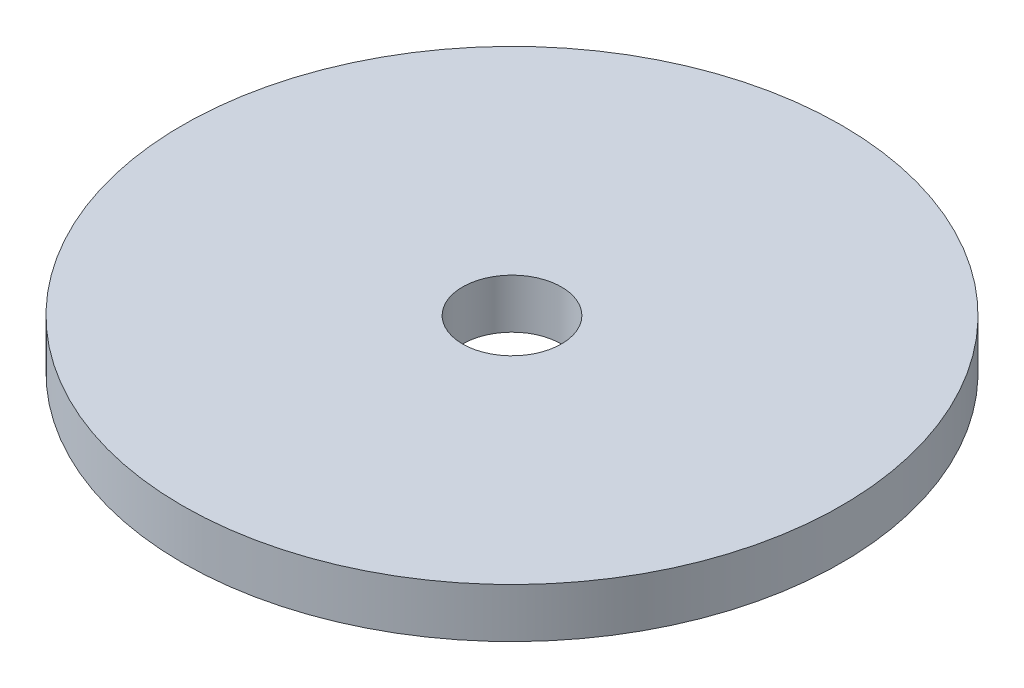
ISO-10303-21;
HEADER;
FILE_DESCRIPTION(('STEP AP214'),'2;1');
FILE_NAME('part.step','',(''),(''),'','','');
FILE_SCHEMA(('AUTOMOTIVE_DESIGN { 1 0 10303 214 1 1 1 1 }'));
ENDSEC;
DATA;
#1=APPLICATION_CONTEXT('core data for automotive mechanical design processes');
#2=APPLICATION_PROTOCOL_DEFINITION('international standard','automotive_design',2000,#1);
#3=PRODUCT_CONTEXT('',#1,'mechanical');
#4=PRODUCT('Part','Part','',(#3));
#5=PRODUCT_RELATED_PRODUCT_CATEGORY('part','',(#4));
#6=PRODUCT_DEFINITION_FORMATION('','',#4);
#7=PRODUCT_DEFINITION_CONTEXT('part definition',#1,'design');
#8=PRODUCT_DEFINITION('design','',#6,#7);
#9=PRODUCT_DEFINITION_SHAPE('','',#8);
#10=(LENGTH_UNIT() NAMED_UNIT(*) SI_UNIT(.MILLI.,.METRE.));
#11=(NAMED_UNIT(*) PLANE_ANGLE_UNIT() SI_UNIT($,.RADIAN.));
#12=(NAMED_UNIT(*) SI_UNIT($,.STERADIAN.) SOLID_ANGLE_UNIT());
#13=UNCERTAINTY_MEASURE_WITH_UNIT(LENGTH_MEASURE(1.E-05),#10,'distance_accuracy_value','');
#14=(GEOMETRIC_REPRESENTATION_CONTEXT(3) GLOBAL_UNCERTAINTY_ASSIGNED_CONTEXT((#13)) GLOBAL_UNIT_ASSIGNED_CONTEXT((#10,
#11,#12)) REPRESENTATION_CONTEXT('',''));
#15=CARTESIAN_POINT('',(0.,0.,0.));
#16=DIRECTION('',(0.,0.,1.));
#17=DIRECTION('',(1.,0.,0.));
#18=AXIS2_PLACEMENT_3D('',#15,#16,#17);
#19=CARTESIAN_POINT('',(0.,6.,0.));
#20=DIRECTION('',(0.,1.,0.));
#21=DIRECTION('',(0.,0.,1.));
#22=AXIS2_PLACEMENT_3D('',#19,#20,#21);
#23=PLANE('',#22);
#24=CARTESIAN_POINT('',(0.,6.,0.));
#25=DIRECTION('',(0.,1.,0.));
#26=DIRECTION('',(0.,0.,1.));
#27=AXIS2_PLACEMENT_3D('',#24,#25,#26);
#28=CIRCLE('',#27,40.);
#29=CARTESIAN_POINT('',(0.,6.,40.));
#30=VERTEX_POINT('',#29);
#31=EDGE_CURVE('E10',#30,#30,#28,.T.);
#32=ORIENTED_EDGE('',*,*,#31,.T.);
#33=EDGE_LOOP('',(#32));
#34=FACE_BOUND('',#33,.T.);
#35=CARTESIAN_POINT('',(0.,6.,0.));
#36=DIRECTION('',(0.,1.,0.));
#37=DIRECTION('',(0.,0.,1.));
#38=AXIS2_PLACEMENT_3D('',#35,#36,#37);
#39=CIRCLE('',#38,6.);
#40=CARTESIAN_POINT('',(0.,6.,6.));
#41=VERTEX_POINT('',#40);
#42=EDGE_CURVE('E42',#41,#41,#39,.T.);
#43=ORIENTED_EDGE('',*,*,#42,.F.);
#44=EDGE_LOOP('',(#43));
#45=FACE_BOUND('',#44,.T.);
#46=ADVANCED_FACE('F31',(#34,#45),#23,.T.);
#47=CARTESIAN_POINT('',(0.,0.,0.));
#48=DIRECTION('',(0.,1.,0.));
#49=DIRECTION('',(0.,0.,1.));
#50=AXIS2_PLACEMENT_3D('',#47,#48,#49);
#51=PLANE('',#50);
#52=CARTESIAN_POINT('',(0.,0.,0.));
#53=DIRECTION('',(0.,1.,0.));
#54=DIRECTION('',(0.,0.,1.));
#55=AXIS2_PLACEMENT_3D('',#52,#53,#54);
#56=CIRCLE('',#55,40.);
#57=CARTESIAN_POINT('',(0.,0.,40.));
#58=VERTEX_POINT('',#57);
#59=EDGE_CURVE('E35',#58,#58,#56,.T.);
#60=ORIENTED_EDGE('',*,*,#59,.F.);
#61=EDGE_LOOP('',(#60));
#62=FACE_BOUND('',#61,.T.);
#63=CARTESIAN_POINT('',(0.,0.,0.));
#64=DIRECTION('',(0.,1.,0.));
#65=DIRECTION('',(0.,0.,1.));
#66=AXIS2_PLACEMENT_3D('',#63,#64,#65);
#67=CIRCLE('',#66,6.);
#68=CARTESIAN_POINT('',(0.,0.,6.));
#69=VERTEX_POINT('',#68);
#70=EDGE_CURVE('E44',#69,#69,#67,.T.);
#71=ORIENTED_EDGE('',*,*,#70,.T.);
#72=EDGE_LOOP('',(#71));
#73=FACE_BOUND('',#72,.T.);
#74=ADVANCED_FACE('F54',(#62,#73),#51,.F.);
#75=CARTESIAN_POINT('',(0.,6.,0.));
#76=DIRECTION('',(0.,-1.,0.));
#77=DIRECTION('',(0.,0.,-1.));
#78=AXIS2_PLACEMENT_3D('',#75,#76,#77);
#79=CYLINDRICAL_SURFACE('',#78,40.);
#80=ORIENTED_EDGE('',*,*,#31,.F.);
#81=EDGE_LOOP('',(#80));
#82=FACE_BOUND('',#81,.T.);
#83=ORIENTED_EDGE('',*,*,#59,.T.);
#84=EDGE_LOOP('',(#83));
#85=FACE_BOUND('',#84,.T.);
#86=ADVANCED_FACE('F33',(#82,#85),#79,.T.);
#87=CARTESIAN_POINT('',(0.,6.,0.));
#88=DIRECTION('',(0.,-1.,0.));
#89=DIRECTION('',(0.,0.,-1.));
#90=AXIS2_PLACEMENT_3D('',#87,#88,#89);
#91=CYLINDRICAL_SURFACE('',#90,6.);
#92=ORIENTED_EDGE('',*,*,#42,.T.);
#93=EDGE_LOOP('',(#92));
#94=FACE_BOUND('',#93,.T.);
#95=ORIENTED_EDGE('',*,*,#70,.F.);
#96=EDGE_LOOP('',(#95));
#97=FACE_BOUND('',#96,.T.);
#98=ADVANCED_FACE('F50',(#94,#97),#91,.F.);
#99=CLOSED_SHELL('',(#46,#74,#86,#98));
#100=MANIFOLD_SOLID_BREP('B2',#99);
#101=ADVANCED_BREP_SHAPE_REPRESENTATION('',(#18,#100),#14);
#102=SHAPE_DEFINITION_REPRESENTATION(#9,#101);
ENDSEC;
END-ISO-10303-21;
